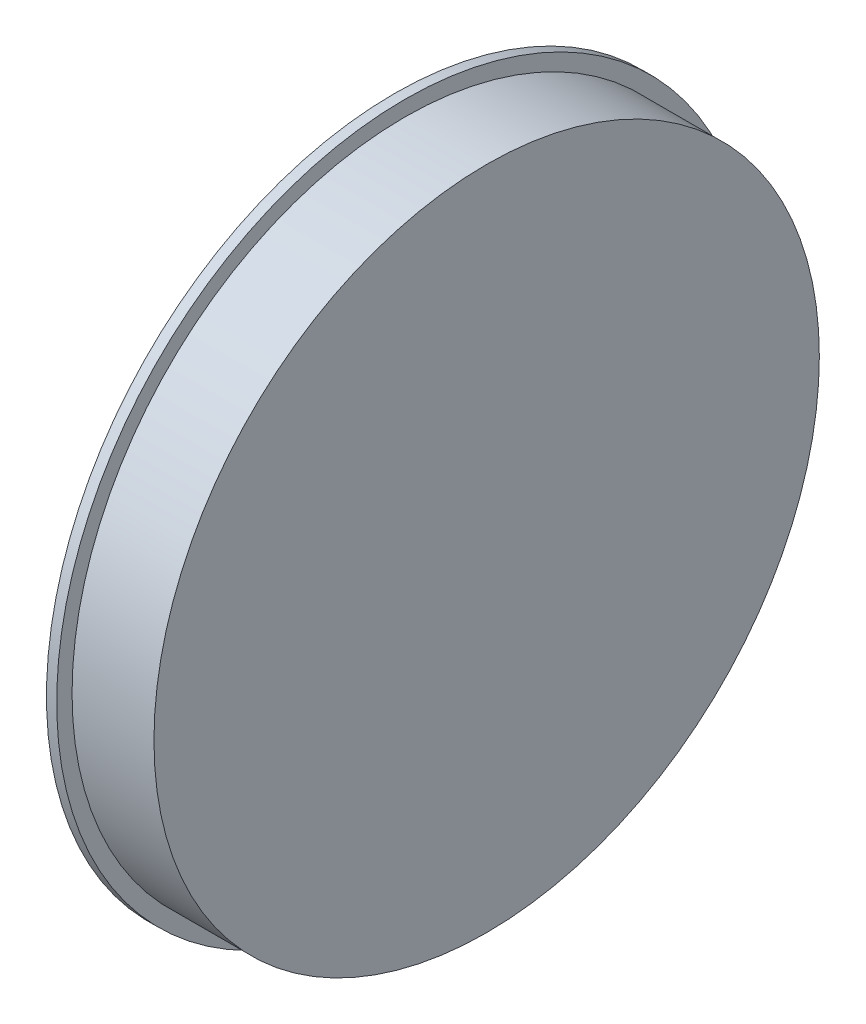
ISO-10303-21;
HEADER;
FILE_DESCRIPTION(('STEP AP214'),'2;1');
FILE_NAME('part.step','',(''),(''),'','','');
FILE_SCHEMA(('AUTOMOTIVE_DESIGN { 1 0 10303 214 1 1 1 1 }'));
ENDSEC;
DATA;
#1=APPLICATION_CONTEXT('core data for automotive mechanical design processes');
#2=APPLICATION_PROTOCOL_DEFINITION('international standard','automotive_design',2000,#1);
#3=PRODUCT_CONTEXT('',#1,'mechanical');
#4=PRODUCT('Part','Part','',(#3));
#5=PRODUCT_RELATED_PRODUCT_CATEGORY('part','',(#4));
#6=PRODUCT_DEFINITION_FORMATION('','',#4);
#7=PRODUCT_DEFINITION_CONTEXT('part definition',#1,'design');
#8=PRODUCT_DEFINITION('design','',#6,#7);
#9=PRODUCT_DEFINITION_SHAPE('','',#8);
#10=(LENGTH_UNIT() NAMED_UNIT(*) SI_UNIT(.MILLI.,.METRE.));
#11=(NAMED_UNIT(*) PLANE_ANGLE_UNIT() SI_UNIT($,.RADIAN.));
#12=(NAMED_UNIT(*) SI_UNIT($,.STERADIAN.) SOLID_ANGLE_UNIT());
#13=UNCERTAINTY_MEASURE_WITH_UNIT(LENGTH_MEASURE(1.E-05),#10,'distance_accuracy_value','');
#14=(GEOMETRIC_REPRESENTATION_CONTEXT(3) GLOBAL_UNCERTAINTY_ASSIGNED_CONTEXT((#13)) GLOBAL_UNIT_ASSIGNED_CONTEXT((#10,
#11,#12)) REPRESENTATION_CONTEXT('',''));
#15=CARTESIAN_POINT('',(0.,0.,0.));
#16=DIRECTION('',(0.,0.,1.));
#17=DIRECTION('',(1.,0.,0.));
#18=AXIS2_PLACEMENT_3D('',#15,#16,#17);
#19=CARTESIAN_POINT('',(0.,0.,0.));
#20=DIRECTION('',(-1.,0.,0.));
#21=DIRECTION('',(0.,-1.,0.));
#22=AXIS2_PLACEMENT_3D('',#19,#20,#21);
#23=PLANE('',#22);
#24=CARTESIAN_POINT('',(0.,0.,0.));
#25=DIRECTION('',(1.,0.,0.));
#26=DIRECTION('',(0.,1.,0.));
#27=AXIS2_PLACEMENT_3D('',#24,#25,#26);
#28=CIRCLE('',#27,34.);
#29=CARTESIAN_POINT('',(0.,34.,0.));
#30=VERTEX_POINT('',#29);
#31=EDGE_CURVE('E10',#30,#30,#28,.T.);
#32=ORIENTED_EDGE('',*,*,#31,.F.);
#33=EDGE_LOOP('',(#32));
#34=FACE_BOUND('',#33,.T.);
#35=ADVANCED_FACE('F30',(#34),#23,.T.);
#36=CARTESIAN_POINT('',(9.,0.,0.));
#37=DIRECTION('',(1.,0.,0.));
#38=DIRECTION('',(0.,1.,0.));
#39=AXIS2_PLACEMENT_3D('',#36,#37,#38);
#40=CYLINDRICAL_SURFACE('',#39,34.);
#41=ORIENTED_EDGE('',*,*,#31,.T.);
#42=EDGE_LOOP('',(#41));
#43=FACE_BOUND('',#42,.T.);
#44=CARTESIAN_POINT('',(0.999999999999999,0.,0.));
#45=DIRECTION('',(1.,0.,0.));
#46=DIRECTION('',(0.,1.,0.));
#47=AXIS2_PLACEMENT_3D('',#44,#45,#46);
#48=CIRCLE('',#47,34.);
#49=CARTESIAN_POINT('',(0.999999999999999,34.,0.));
#50=VERTEX_POINT('',#49);
#51=EDGE_CURVE('E36',#50,#50,#48,.T.);
#52=ORIENTED_EDGE('',*,*,#51,.F.);
#53=EDGE_LOOP('',(#52));
#54=FACE_BOUND('',#53,.T.);
#55=ADVANCED_FACE('F62',(#43,#54),#40,.T.);
#56=CARTESIAN_POINT('',(1.,34.,0.));
#57=DIRECTION('',(1.,0.,0.));
#58=DIRECTION('',(0.,1.,0.));
#59=AXIS2_PLACEMENT_3D('',#56,#57,#58);
#60=PLANE('',#59);
#61=ORIENTED_EDGE('',*,*,#51,.T.);
#62=EDGE_LOOP('',(#61));
#63=FACE_BOUND('',#62,.T.);
#64=CARTESIAN_POINT('',(1.,0.,0.));
#65=DIRECTION('',(1.,0.,0.));
#66=DIRECTION('',(0.,1.,0.));
#67=AXIS2_PLACEMENT_3D('',#64,#65,#66);
#68=CIRCLE('',#67,32.5);
#69=CARTESIAN_POINT('',(1.,32.5,0.));
#70=VERTEX_POINT('',#69);
#71=EDGE_CURVE('E40',#70,#70,#68,.T.);
#72=ORIENTED_EDGE('',*,*,#71,.F.);
#73=EDGE_LOOP('',(#72));
#74=FACE_BOUND('',#73,.T.);
#75=ADVANCED_FACE('F54',(#63,#74),#60,.T.);
#76=CARTESIAN_POINT('',(9.,0.,0.));
#77=DIRECTION('',(1.,0.,0.));
#78=DIRECTION('',(0.,1.,0.));
#79=AXIS2_PLACEMENT_3D('',#76,#77,#78);
#80=CYLINDRICAL_SURFACE('',#79,32.5);
#81=ORIENTED_EDGE('',*,*,#71,.T.);
#82=EDGE_LOOP('',(#81));
#83=FACE_BOUND('',#82,.T.);
#84=CARTESIAN_POINT('',(9.,0.,0.));
#85=DIRECTION('',(1.,0.,0.));
#86=DIRECTION('',(0.,1.,0.));
#87=AXIS2_PLACEMENT_3D('',#84,#85,#86);
#88=CIRCLE('',#87,32.5);
#89=CARTESIAN_POINT('',(9.,32.5,0.));
#90=VERTEX_POINT('',#89);
#91=EDGE_CURVE('E44',#90,#90,#88,.T.);
#92=ORIENTED_EDGE('',*,*,#91,.F.);
#93=EDGE_LOOP('',(#92));
#94=FACE_BOUND('',#93,.T.);
#95=ADVANCED_FACE('F52',(#83,#94),#80,.T.);
#96=CARTESIAN_POINT('',(9.,32.5,0.));
#97=DIRECTION('',(1.,0.,0.));
#98=DIRECTION('',(0.,1.,0.));
#99=AXIS2_PLACEMENT_3D('',#96,#97,#98);
#100=PLANE('',#99);
#101=ORIENTED_EDGE('',*,*,#91,.T.);
#102=EDGE_LOOP('',(#101));
#103=FACE_BOUND('',#102,.T.);
#104=ADVANCED_FACE('F50',(#103),#100,.T.);
#105=CLOSED_SHELL('',(#35,#55,#75,#95,#104));
#106=MANIFOLD_SOLID_BREP('B2',#105);
#107=ADVANCED_BREP_SHAPE_REPRESENTATION('',(#18,#106),#14);
#108=SHAPE_DEFINITION_REPRESENTATION(#9,#107);
ENDSEC;
END-ISO-10303-21;
